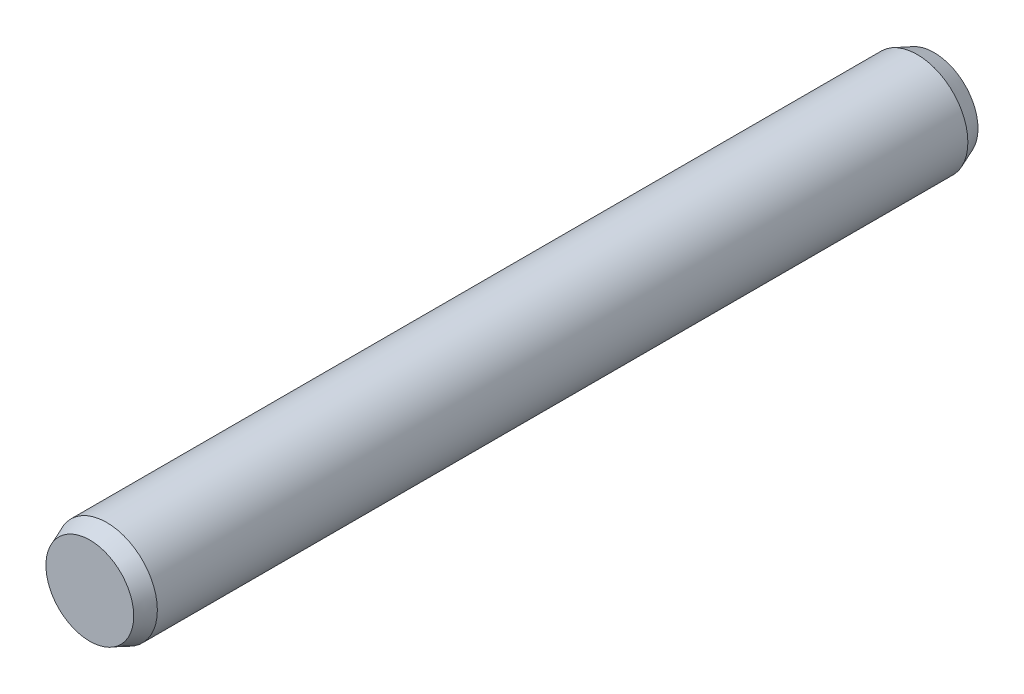
ISO-10303-21;
HEADER;
FILE_DESCRIPTION(('STEP AP214'),'2;1');
FILE_NAME('part.step','',(''),(''),'','','');
FILE_SCHEMA(('AUTOMOTIVE_DESIGN { 1 0 10303 214 1 1 1 1 }'));
ENDSEC;
DATA;
#1=APPLICATION_CONTEXT('core data for automotive mechanical design processes');
#2=APPLICATION_PROTOCOL_DEFINITION('international standard','automotive_design',2000,#1);
#3=PRODUCT_CONTEXT('',#1,'mechanical');
#4=PRODUCT('Part','Part','',(#3));
#5=PRODUCT_RELATED_PRODUCT_CATEGORY('part','',(#4));
#6=PRODUCT_DEFINITION_FORMATION('','',#4);
#7=PRODUCT_DEFINITION_CONTEXT('part definition',#1,'design');
#8=PRODUCT_DEFINITION('design','',#6,#7);
#9=PRODUCT_DEFINITION_SHAPE('','',#8);
#10=(LENGTH_UNIT() NAMED_UNIT(*) SI_UNIT(.MILLI.,.METRE.));
#11=(NAMED_UNIT(*) PLANE_ANGLE_UNIT() SI_UNIT($,.RADIAN.));
#12=(NAMED_UNIT(*) SI_UNIT($,.STERADIAN.) SOLID_ANGLE_UNIT());
#13=UNCERTAINTY_MEASURE_WITH_UNIT(LENGTH_MEASURE(1.E-05),#10,'distance_accuracy_value','');
#14=(GEOMETRIC_REPRESENTATION_CONTEXT(3) GLOBAL_UNCERTAINTY_ASSIGNED_CONTEXT((#13)) GLOBAL_UNIT_ASSIGNED_CONTEXT((#10,
#11,#12)) REPRESENTATION_CONTEXT('',''));
#15=CARTESIAN_POINT('',(0.,0.,0.));
#16=DIRECTION('',(0.,0.,1.));
#17=DIRECTION('',(1.,0.,0.));
#18=AXIS2_PLACEMENT_3D('',#15,#16,#17);
#19=CARTESIAN_POINT('',(0.,0.,12.5));
#20=DIRECTION('',(0.,0.,-1.));
#21=DIRECTION('',(-1.,0.,0.));
#22=AXIS2_PLACEMENT_3D('',#19,#20,#21);
#23=CYLINDRICAL_SURFACE('',#22,1.5);
#24=CARTESIAN_POINT('',(0.,0.,-12.));
#25=DIRECTION('',(0.,0.,1.));
#26=DIRECTION('',(1.,0.,0.));
#27=AXIS2_PLACEMENT_3D('',#24,#25,#26);
#28=CIRCLE('',#27,1.5);
#29=CARTESIAN_POINT('',(1.5,0.,-12.));
#30=VERTEX_POINT('',#29);
#31=EDGE_CURVE('E54',#30,#30,#28,.T.);
#32=ORIENTED_EDGE('',*,*,#31,.T.);
#33=EDGE_LOOP('',(#32));
#34=FACE_BOUND('',#33,.T.);
#35=CARTESIAN_POINT('',(0.,0.,12.));
#36=DIRECTION('',(0.,0.,1.));
#37=DIRECTION('',(1.,0.,0.));
#38=AXIS2_PLACEMENT_3D('',#35,#36,#37);
#39=CIRCLE('',#38,1.5);
#40=CARTESIAN_POINT('',(1.5,0.,12.));
#41=VERTEX_POINT('',#40);
#42=EDGE_CURVE('E59',#41,#41,#39,.F.);
#43=ORIENTED_EDGE('',*,*,#42,.T.);
#44=EDGE_LOOP('',(#43));
#45=FACE_BOUND('',#44,.T.);
#46=ADVANCED_FACE('F45',(#34,#45),#23,.T.);
#47=CARTESIAN_POINT('',(0.,0.,12.5));
#48=DIRECTION('',(0.,0.,1.));
#49=DIRECTION('',(1.,0.,0.));
#50=AXIS2_PLACEMENT_3D('',#47,#48,#49);
#51=PLANE('',#50);
#52=CARTESIAN_POINT('',(0.,0.,12.5));
#53=DIRECTION('',(0.,0.,1.));
#54=DIRECTION('',(1.,0.,0.));
#55=AXIS2_PLACEMENT_3D('',#52,#53,#54);
#56=CIRCLE('',#55,1.3);
#57=CARTESIAN_POINT('',(1.3,0.,12.5));
#58=VERTEX_POINT('',#57);
#59=EDGE_CURVE('E64',#58,#58,#56,.T.);
#60=ORIENTED_EDGE('',*,*,#59,.T.);
#61=EDGE_LOOP('',(#60));
#62=FACE_BOUND('',#61,.T.);
#63=ADVANCED_FACE('F71',(#62),#51,.T.);
#64=CARTESIAN_POINT('',(0.,0.,-12.5));
#65=DIRECTION('',(0.,0.,1.));
#66=DIRECTION('',(1.,0.,0.));
#67=AXIS2_PLACEMENT_3D('',#64,#65,#66);
#68=PLANE('',#67);
#69=CARTESIAN_POINT('',(0.,0.,-12.5));
#70=DIRECTION('',(0.,0.,1.));
#71=DIRECTION('',(1.,0.,0.));
#72=AXIS2_PLACEMENT_3D('',#69,#70,#71);
#73=CIRCLE('',#72,1.29999999999999);
#74=CARTESIAN_POINT('',(1.29999999999999,0.,-12.5));
#75=VERTEX_POINT('',#74);
#76=EDGE_CURVE('E10',#75,#75,#73,.F.);
#77=ORIENTED_EDGE('',*,*,#76,.T.);
#78=EDGE_LOOP('',(#77));
#79=FACE_BOUND('',#78,.T.);
#80=ADVANCED_FACE('F75',(#79),#68,.F.);
#81=CARTESIAN_POINT('',(0.,0.,12.5));
#82=DIRECTION('',(0.,0.,-1.));
#83=DIRECTION('',(-1.,0.,0.));
#84=AXIS2_PLACEMENT_3D('',#81,#82,#83);
#85=CONICAL_SURFACE('',#84,1.3,0.380506377112361);
#86=ORIENTED_EDGE('',*,*,#42,.F.);
#87=EDGE_LOOP('',(#86));
#88=FACE_BOUND('',#87,.T.);
#89=ORIENTED_EDGE('',*,*,#59,.F.);
#90=EDGE_LOOP('',(#89));
#91=FACE_BOUND('',#90,.T.);
#92=ADVANCED_FACE('F73',(#88,#91),#85,.T.);
#93=CARTESIAN_POINT('',(0.,0.,-12.));
#94=DIRECTION('',(0.,0.,1.));
#95=DIRECTION('',(1.,0.,0.));
#96=AXIS2_PLACEMENT_3D('',#93,#94,#95);
#97=CONICAL_SURFACE('',#96,1.5,0.380506377112361);
#98=ORIENTED_EDGE('',*,*,#76,.F.);
#99=EDGE_LOOP('',(#98));
#100=FACE_BOUND('',#99,.T.);
#101=ORIENTED_EDGE('',*,*,#31,.F.);
#102=EDGE_LOOP('',(#101));
#103=FACE_BOUND('',#102,.T.);
#104=ADVANCED_FACE('F48',(#100,#103),#97,.T.);
#105=CLOSED_SHELL('',(#46,#63,#80,#92,#104));
#106=MANIFOLD_SOLID_BREP('B2',#105);
#107=ADVANCED_BREP_SHAPE_REPRESENTATION('',(#18,#106),#14);
#108=SHAPE_DEFINITION_REPRESENTATION(#9,#107);
ENDSEC;
END-ISO-10303-21;
